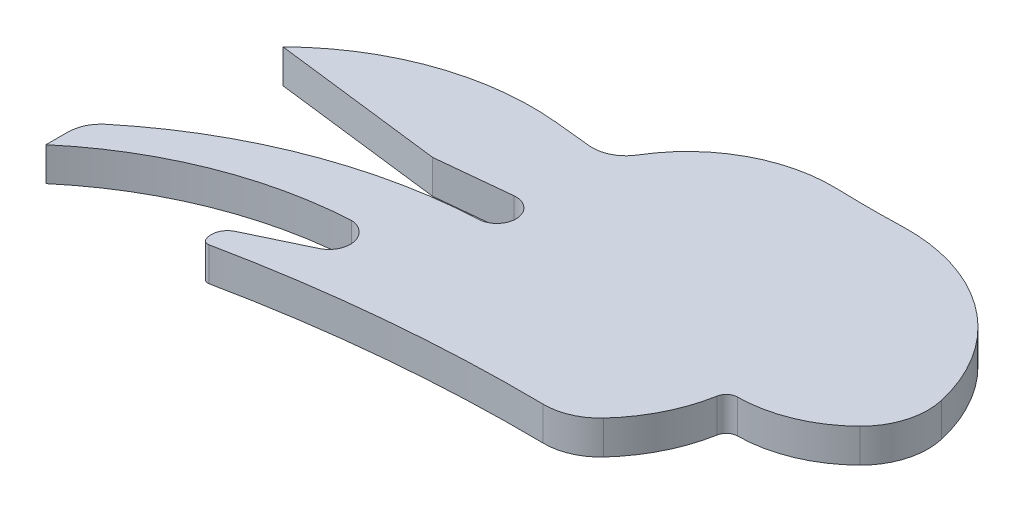
ISO-10303-21;
HEADER;
FILE_DESCRIPTION(('STEP AP214'),'2;1');
FILE_NAME('part.step','',(''),(''),'','','');
FILE_SCHEMA(('AUTOMOTIVE_DESIGN { 1 0 10303 214 1 1 1 1 }'));
ENDSEC;
DATA;
#1=APPLICATION_CONTEXT('core data for automotive mechanical design processes');
#2=APPLICATION_PROTOCOL_DEFINITION('international standard','automotive_design',2000,#1);
#3=PRODUCT_CONTEXT('',#1,'mechanical');
#4=PRODUCT('Part','Part','',(#3));
#5=PRODUCT_RELATED_PRODUCT_CATEGORY('part','',(#4));
#6=PRODUCT_DEFINITION_FORMATION('','',#4);
#7=PRODUCT_DEFINITION_CONTEXT('part definition',#1,'design');
#8=PRODUCT_DEFINITION('design','',#6,#7);
#9=PRODUCT_DEFINITION_SHAPE('','',#8);
#10=(LENGTH_UNIT() NAMED_UNIT(*) SI_UNIT(.MILLI.,.METRE.));
#11=(NAMED_UNIT(*) PLANE_ANGLE_UNIT() SI_UNIT($,.RADIAN.));
#12=(NAMED_UNIT(*) SI_UNIT($,.STERADIAN.) SOLID_ANGLE_UNIT());
#13=UNCERTAINTY_MEASURE_WITH_UNIT(LENGTH_MEASURE(1.E-05),#10,'distance_accuracy_value','');
#14=(GEOMETRIC_REPRESENTATION_CONTEXT(3) GLOBAL_UNCERTAINTY_ASSIGNED_CONTEXT((#13)) GLOBAL_UNIT_ASSIGNED_CONTEXT((#10,
#11,#12)) REPRESENTATION_CONTEXT('',''));
#15=CARTESIAN_POINT('',(0.,0.,0.));
#16=DIRECTION('',(0.,0.,1.));
#17=DIRECTION('',(1.,0.,0.));
#18=AXIS2_PLACEMENT_3D('',#15,#16,#17);
#19=CARTESIAN_POINT('',(0.,3.,-0.53));
#20=DIRECTION('',(-1.,0.,0.));
#21=DIRECTION('',(0.,0.,1.));
#22=AXIS2_PLACEMENT_3D('',#19,#20,#21);
#23=PLANE('',#22);
#24=DIRECTION('',(0.,0.,-1.));
#25=VECTOR('',#24,1.);
#26=CARTESIAN_POINT('',(0.,3.,-0.53));
#27=LINE('',#26,#25);
#28=CARTESIAN_POINT('',(0.,3.,-0.529999999999989));
#29=VERTEX_POINT('',#28);
#30=CARTESIAN_POINT('',(0.,3.,-2.45030055685));
#31=VERTEX_POINT('',#30);
#32=EDGE_CURVE('E198',#29,#31,#27,.T.);
#33=ORIENTED_EDGE('',*,*,#32,.T.);
#34=DIRECTION('',(0.,-1.,0.));
#35=VECTOR('',#34,1.);
#36=CARTESIAN_POINT('',(0.,3.,-2.45030055685));
#37=LINE('',#36,#35);
#38=CARTESIAN_POINT('',(0.,0.,-2.45030055685));
#39=VERTEX_POINT('',#38);
#40=EDGE_CURVE('E240',#31,#39,#37,.T.);
#41=ORIENTED_EDGE('',*,*,#40,.T.);
#42=DIRECTION('',(0.,0.,-1.));
#43=VECTOR('',#42,1.);
#44=CARTESIAN_POINT('',(0.,0.,-0.53));
#45=LINE('',#44,#43);
#46=CARTESIAN_POINT('',(0.,0.,-0.529999999999989));
#47=VERTEX_POINT('',#46);
#48=EDGE_CURVE('E381',#47,#39,#45,.T.);
#49=ORIENTED_EDGE('',*,*,#48,.F.);
#50=DIRECTION('',(0.,-1.,0.));
#51=VECTOR('',#50,1.);
#52=CARTESIAN_POINT('',(0.,3.,-0.529999999999989));
#53=LINE('',#52,#51);
#54=EDGE_CURVE('E224',#29,#47,#53,.T.);
#55=ORIENTED_EDGE('',*,*,#54,.F.);
#56=EDGE_LOOP('',(#33,#41,#49,#55));
#57=FACE_BOUND('',#56,.T.);
#58=ADVANCED_FACE('F33',(#57),#23,.T.);
#59=CARTESIAN_POINT('',(21.2415581415774,3.,24.490852788314));
#60=DIRECTION('',(0.,-1.,0.));
#61=DIRECTION('',(0.,0.,-1.));
#62=AXIS2_PLACEMENT_3D('',#59,#60,#61);
#63=CYLINDRICAL_SURFACE('',#62,32.8214391295765);
#64=CARTESIAN_POINT('',(21.2415581415774,0.,24.490852788314));
#65=DIRECTION('',(0.,-1.,0.));
#66=DIRECTION('',(0.,0.,-1.));
#67=AXIS2_PLACEMENT_3D('',#64,#65,#66);
#68=CIRCLE('',#67,32.8214391295765);
#69=CARTESIAN_POINT('',(19.42,0.,-8.28));
#70=VERTEX_POINT('',#69);
#71=EDGE_CURVE('E306',#47,#70,#68,.T.);
#72=ORIENTED_EDGE('',*,*,#71,.T.);
#73=DIRECTION('',(0.,-1.,0.));
#74=VECTOR('',#73,1.);
#75=CARTESIAN_POINT('',(19.42,3.,-8.28));
#76=LINE('',#75,#74);
#77=CARTESIAN_POINT('',(19.42,3.,-8.28));
#78=VERTEX_POINT('',#77);
#79=EDGE_CURVE('E309',#78,#70,#76,.T.);
#80=ORIENTED_EDGE('',*,*,#79,.F.);
#81=CARTESIAN_POINT('',(21.2415581415774,3.,24.490852788314));
#82=DIRECTION('',(0.,-1.,0.));
#83=DIRECTION('',(0.,0.,-1.));
#84=AXIS2_PLACEMENT_3D('',#81,#82,#83);
#85=CIRCLE('',#84,32.8214391295765);
#86=EDGE_CURVE('E212',#29,#78,#85,.T.);
#87=ORIENTED_EDGE('',*,*,#86,.F.);
#88=ORIENTED_EDGE('',*,*,#54,.T.);
#89=EDGE_LOOP('',(#72,#80,#87,#88));
#90=FACE_BOUND('',#89,.T.);
#91=ADVANCED_FACE('F428',(#90),#63,.F.);
#92=CARTESIAN_POINT('',(19.3041987318064,3.,-6.3835322132225));
#93=DIRECTION('',(0.,-1.,0.));
#94=DIRECTION('',(0.,0.,-1.));
#95=AXIS2_PLACEMENT_3D('',#92,#93,#94);
#96=CYLINDRICAL_SURFACE('',#95,1.9);
#97=CARTESIAN_POINT('',(19.3041987318064,0.,-6.3835322132225));
#98=DIRECTION('',(0.,-1.,0.));
#99=DIRECTION('',(0.,0.,-1.));
#100=AXIS2_PLACEMENT_3D('',#97,#98,#99);
#101=CIRCLE('',#100,1.9);
#102=CARTESIAN_POINT('',(20.1225437860053,0.,-4.66879859768098));
#103=VERTEX_POINT('',#102);
#104=EDGE_CURVE('E304',#70,#103,#101,.T.);
#105=ORIENTED_EDGE('',*,*,#104,.T.);
#106=DIRECTION('',(0.,-1.,0.));
#107=VECTOR('',#106,1.);
#108=CARTESIAN_POINT('',(20.1225437860053,3.,-4.66879859768098));
#109=LINE('',#108,#107);
#110=CARTESIAN_POINT('',(20.1225437860053,3.,-4.66879859768098));
#111=VERTEX_POINT('',#110);
#112=EDGE_CURVE('E312',#111,#103,#109,.T.);
#113=ORIENTED_EDGE('',*,*,#112,.F.);
#114=CARTESIAN_POINT('',(19.3041987318064,3.,-6.3835322132225));
#115=DIRECTION('',(0.,-1.,0.));
#116=DIRECTION('',(0.,0.,-1.));
#117=AXIS2_PLACEMENT_3D('',#114,#115,#116);
#118=CIRCLE('',#117,1.9);
#119=EDGE_CURVE('E216',#78,#111,#118,.T.);
#120=ORIENTED_EDGE('',*,*,#119,.F.);
#121=ORIENTED_EDGE('',*,*,#79,.T.);
#122=EDGE_LOOP('',(#105,#113,#120,#121));
#123=FACE_BOUND('',#122,.T.);
#124=ADVANCED_FACE('F433',(#123),#96,.F.);
#125=CARTESIAN_POINT('',(20.1225437860053,3.,-4.66879859768098));
#126=DIRECTION('',(0.430707923262615,0.,0.902491376600799));
#127=DIRECTION('',(0.902491376600799,0.,-0.430707923262615));
#128=AXIS2_PLACEMENT_3D('',#125,#126,#127);
#129=PLANE('',#128);
#130=DIRECTION('',(-0.902491376600799,0.,0.430707923262615));
#131=VECTOR('',#130,1.);
#132=CARTESIAN_POINT('',(20.1225437860053,0.,-4.66879859768098));
#133=LINE('',#132,#131);
#134=CARTESIAN_POINT('',(15.0924937069669,0.,-2.26824111910476));
#135=VERTEX_POINT('',#134);
#136=EDGE_CURVE('E296',#103,#135,#133,.T.);
#137=ORIENTED_EDGE('',*,*,#136,.T.);
#138=DIRECTION('',(0.,-1.,0.));
#139=VECTOR('',#138,1.);
#140=CARTESIAN_POINT('',(15.0924937069669,3.,-2.26824111910476));
#141=LINE('',#140,#139);
#142=CARTESIAN_POINT('',(15.0924937069669,3.,-2.26824111910476));
#143=VERTEX_POINT('',#142);
#144=EDGE_CURVE('E315',#143,#135,#141,.T.);
#145=ORIENTED_EDGE('',*,*,#144,.F.);
#146=DIRECTION('',(-0.902491376600799,0.,0.430707923262615));
#147=VECTOR('',#146,1.);
#148=CARTESIAN_POINT('',(20.1225437860053,3.,-4.66879859768098));
#149=LINE('',#148,#147);
#150=EDGE_CURVE('E377',#111,#143,#149,.T.);
#151=ORIENTED_EDGE('',*,*,#150,.F.);
#152=ORIENTED_EDGE('',*,*,#112,.T.);
#153=EDGE_LOOP('',(#137,#145,#151,#152));
#154=FACE_BOUND('',#153,.T.);
#155=ADVANCED_FACE('F497',(#154),#129,.F.);
#156=CARTESIAN_POINT('',(15.7170201956977,3.,-0.959628623033598));
#157=DIRECTION('',(0.,-1.,0.));
#158=DIRECTION('',(0.,0.,-1.));
#159=AXIS2_PLACEMENT_3D('',#156,#157,#158);
#160=CYLINDRICAL_SURFACE('',#159,1.45);
#161=CARTESIAN_POINT('',(15.7170201956977,0.,-0.959628623033598));
#162=DIRECTION('',(0.,-1.,0.));
#163=DIRECTION('',(0.,0.,-1.));
#164=AXIS2_PLACEMENT_3D('',#161,#162,#163);
#165=CIRCLE('',#164,1.45);
#166=CARTESIAN_POINT('',(14.4031751109504,0.,-0.346186618207208));
#167=VERTEX_POINT('',#166);
#168=EDGE_CURVE('E293',#167,#135,#165,.T.);
#169=ORIENTED_EDGE('',*,*,#168,.F.);
#170=DIRECTION('',(0.,-1.,0.));
#171=VECTOR('',#170,1.);
#172=CARTESIAN_POINT('',(14.4031751109504,3.,-0.346186618207208));
#173=LINE('',#172,#171);
#174=CARTESIAN_POINT('',(14.4031751109504,3.,-0.346186618207208));
#175=VERTEX_POINT('',#174);
#176=EDGE_CURVE('E41',#167,#175,#173,.F.);
#177=ORIENTED_EDGE('',*,*,#176,.T.);
#178=CARTESIAN_POINT('',(15.7170201956977,3.,-0.959628623033598));
#179=DIRECTION('',(0.,-1.,0.));
#180=DIRECTION('',(0.,0.,-1.));
#181=AXIS2_PLACEMENT_3D('',#178,#179,#180);
#182=CIRCLE('',#181,1.45);
#183=EDGE_CURVE('E375',#175,#143,#182,.T.);
#184=ORIENTED_EDGE('',*,*,#183,.T.);
#185=ORIENTED_EDGE('',*,*,#144,.T.);
#186=EDGE_LOOP('',(#169,#177,#184,#185));
#187=FACE_BOUND('',#186,.T.);
#188=ADVANCED_FACE('F471',(#187),#160,.T.);
#189=CARTESIAN_POINT('',(40.3394246692763,3.,122.849662581525));
#190=DIRECTION('',(0.,-1.,0.));
#191=DIRECTION('',(0.,0.,-1.));
#192=AXIS2_PLACEMENT_3D('',#189,#190,#191);
#193=CYLINDRICAL_SURFACE('',#192,125.511011920149);
#194=CARTESIAN_POINT('',(40.3394246692763,3.,122.849662581525));
#195=DIRECTION('',(0.,-1.,0.));
#196=DIRECTION('',(0.,0.,-1.));
#197=AXIS2_PLACEMENT_3D('',#194,#195,#196);
#198=CIRCLE('',#197,125.511011920149);
#199=CARTESIAN_POINT('',(14.9573401107634,3.,-0.0680493101476443));
#200=VERTEX_POINT('',#199);
#201=CARTESIAN_POINT('',(42.0864421166134,3.,-2.6491901752171));
#202=VERTEX_POINT('',#201);
#203=EDGE_CURVE('E287',#200,#202,#198,.T.);
#204=ORIENTED_EDGE('',*,*,#203,.F.);
#205=DIRECTION('',(0.,-1.,0.));
#206=VECTOR('',#205,1.);
#207=CARTESIAN_POINT('',(14.9573401107634,3.,-0.0680493101476443));
#208=LINE('',#207,#206);
#209=CARTESIAN_POINT('',(14.9573401107634,0.,-0.0680493101476443));
#210=VERTEX_POINT('',#209);
#211=EDGE_CURVE('E279',#200,#210,#208,.T.);
#212=ORIENTED_EDGE('',*,*,#211,.T.);
#213=CARTESIAN_POINT('',(40.3394246692763,0.,122.849662581525));
#214=DIRECTION('',(0.,-1.,0.));
#215=DIRECTION('',(0.,0.,-1.));
#216=AXIS2_PLACEMENT_3D('',#213,#214,#215);
#217=CIRCLE('',#216,125.511011920149);
#218=CARTESIAN_POINT('',(42.0864421166134,0.,-2.6491901752171));
#219=VERTEX_POINT('',#218);
#220=EDGE_CURVE('E286',#210,#219,#217,.T.);
#221=ORIENTED_EDGE('',*,*,#220,.T.);
#222=DIRECTION('',(0.,-1.,0.));
#223=VECTOR('',#222,1.);
#224=CARTESIAN_POINT('',(42.0864421166134,3.,-2.64919017521713));
#225=LINE('',#224,#223);
#226=EDGE_CURVE('E274',#219,#202,#225,.F.);
#227=ORIENTED_EDGE('',*,*,#226,.T.);
#228=EDGE_LOOP('',(#204,#212,#221,#227));
#229=FACE_BOUND('',#228,.T.);
#230=ADVANCED_FACE('F285',(#229),#193,.F.);
#231=CARTESIAN_POINT('',(35.9267681905486,3.,-13.4056740718196));
#232=DIRECTION('',(0.,-1.,0.));
#233=DIRECTION('',(0.,0.,-1.));
#234=AXIS2_PLACEMENT_3D('',#231,#232,#233);
#235=CYLINDRICAL_SURFACE('',#234,13.4821276747402);
#236=CARTESIAN_POINT('',(35.9267681905486,3.,-13.4056740718196));
#237=DIRECTION('',(0.,1.,0.));
#238=DIRECTION('',(0.,0.,1.));
#239=AXIS2_PLACEMENT_3D('',#236,#237,#238);
#240=CIRCLE('',#239,13.4821276747402);
#241=CARTESIAN_POINT('',(45.8280356718605,3.,-4.25511841101342));
#242=VERTEX_POINT('',#241);
#243=CARTESIAN_POINT('',(49.1949671002402,3.,-11.0134649816991));
#244=VERTEX_POINT('',#243);
#245=EDGE_CURVE('E367',#242,#244,#240,.T.);
#246=ORIENTED_EDGE('',*,*,#245,.F.);
#247=DIRECTION('',(0.,-1.,0.));
#248=VECTOR('',#247,1.);
#249=CARTESIAN_POINT('',(45.8280356718605,3.,-4.25511841101342));
#250=LINE('',#249,#248);
#251=CARTESIAN_POINT('',(45.8280356718605,0.,-4.25511841101342));
#252=VERTEX_POINT('',#251);
#253=EDGE_CURVE('E268',#242,#252,#250,.T.);
#254=ORIENTED_EDGE('',*,*,#253,.T.);
#255=CARTESIAN_POINT('',(35.9267681905486,0.,-13.4056740718196));
#256=DIRECTION('',(0.,1.,0.));
#257=DIRECTION('',(0.,0.,1.));
#258=AXIS2_PLACEMENT_3D('',#255,#256,#257);
#259=CIRCLE('',#258,13.4821276747402);
#260=CARTESIAN_POINT('',(49.1949671002402,0.,-11.0134649816991));
#261=VERTEX_POINT('',#260);
#262=EDGE_CURVE('E294',#252,#261,#259,.T.);
#263=ORIENTED_EDGE('',*,*,#262,.T.);
#264=DIRECTION('',(0.,-1.,0.));
#265=VECTOR('',#264,1.);
#266=CARTESIAN_POINT('',(49.1949671002402,3.,-11.0134649816991));
#267=LINE('',#266,#265);
#268=EDGE_CURVE('E260',#261,#244,#267,.F.);
#269=ORIENTED_EDGE('',*,*,#268,.T.);
#270=EDGE_LOOP('',(#246,#254,#263,#269));
#271=FACE_BOUND('',#270,.T.);
#272=ADVANCED_FACE('F462',(#271),#235,.T.);
#273=CARTESIAN_POINT('',(50.0588092689043,3.,-22.9566915039352));
#274=DIRECTION('',(0.,-1.,0.));
#275=DIRECTION('',(0.,0.,-1.));
#276=AXIS2_PLACEMENT_3D('',#273,#274,#275);
#277=CYLINDRICAL_SURFACE('',#276,11.1212589876023);
#278=CARTESIAN_POINT('',(50.0588092689043,3.,-22.9566915039352));
#279=DIRECTION('',(0.,-1.,0.));
#280=DIRECTION('',(0.,0.,-1.));
#281=AXIS2_PLACEMENT_3D('',#278,#279,#280);
#282=CIRCLE('',#281,11.1212589876023);
#283=CARTESIAN_POINT('',(57.8595585532233,3.,-15.0301088813593));
#284=VERTEX_POINT('',#283);
#285=CARTESIAN_POINT('',(50.1691756111334,3.,-11.8359801624863));
#286=VERTEX_POINT('',#285);
#287=EDGE_CURVE('E365',#284,#286,#282,.T.);
#288=ORIENTED_EDGE('',*,*,#287,.T.);
#289=DIRECTION('',(0.,-1.,0.));
#290=VECTOR('',#289,1.);
#291=CARTESIAN_POINT('',(50.1691756111334,3.,-11.8359801624863));
#292=LINE('',#291,#290);
#293=CARTESIAN_POINT('',(50.1691756111334,0.,-11.8359801624863));
#294=VERTEX_POINT('',#293);
#295=EDGE_CURVE('E257',#286,#294,#292,.T.);
#296=ORIENTED_EDGE('',*,*,#295,.T.);
#297=CARTESIAN_POINT('',(50.0588092689043,0.,-22.9566915039352));
#298=DIRECTION('',(0.,-1.,0.));
#299=DIRECTION('',(0.,0.,-1.));
#300=AXIS2_PLACEMENT_3D('',#297,#298,#299);
#301=CIRCLE('',#300,11.1212589876023);
#302=CARTESIAN_POINT('',(57.8595585532233,0.,-15.0301088813593));
#303=VERTEX_POINT('',#302);
#304=EDGE_CURVE('E298',#303,#294,#301,.T.);
#305=ORIENTED_EDGE('',*,*,#304,.F.);
#306=DIRECTION('',(0.,-1.,0.));
#307=VECTOR('',#306,1.);
#308=CARTESIAN_POINT('',(57.8595585532233,3.,-15.0301088813593));
#309=LINE('',#308,#307);
#310=EDGE_CURVE('E226',#303,#284,#309,.F.);
#311=ORIENTED_EDGE('',*,*,#310,.T.);
#312=EDGE_LOOP('',(#288,#296,#305,#311));
#313=FACE_BOUND('',#312,.T.);
#314=ADVANCED_FACE('F355',(#313),#277,.T.);
#315=CARTESIAN_POINT('',(44.8756529626829,3.,-17.3082270959628));
#316=DIRECTION('',(0.,-1.,0.));
#317=DIRECTION('',(0.,0.,-1.));
#318=AXIS2_PLACEMENT_3D('',#315,#316,#317);
#319=CYLINDRICAL_SURFACE('',#318,15.);
#320=CARTESIAN_POINT('',(44.8756529626829,0.,-17.3082270959628));
#321=DIRECTION('',(0.,-1.,0.));
#322=DIRECTION('',(0.,0.,-1.));
#323=AXIS2_PLACEMENT_3D('',#320,#321,#322);
#324=CIRCLE('',#323,15.);
#325=CARTESIAN_POINT('',(44.3947945783583,0.,-32.300517621904));
#326=VERTEX_POINT('',#325);
#327=CARTESIAN_POINT('',(59.5012274511255,0.,-20.6387782339905));
#328=VERTEX_POINT('',#327);
#329=EDGE_CURVE('E347',#326,#328,#324,.T.);
#330=ORIENTED_EDGE('',*,*,#329,.F.);
#331=DIRECTION('',(0.,-1.,0.));
#332=VECTOR('',#331,1.);
#333=CARTESIAN_POINT('',(44.3947945783583,3.,-32.300517621904));
#334=LINE('',#333,#332);
#335=CARTESIAN_POINT('',(44.3947945783583,3.,-32.300517621904));
#336=VERTEX_POINT('',#335);
#337=EDGE_CURVE('E234',#326,#336,#334,.F.);
#338=ORIENTED_EDGE('',*,*,#337,.T.);
#339=CARTESIAN_POINT('',(44.8756529626829,3.,-17.3082270959628));
#340=DIRECTION('',(0.,-1.,0.));
#341=DIRECTION('',(0.,0.,-1.));
#342=AXIS2_PLACEMENT_3D('',#339,#340,#341);
#343=CIRCLE('',#342,15.);
#344=CARTESIAN_POINT('',(59.5012274511255,3.,-20.6387782339905));
#345=VERTEX_POINT('',#344);
#346=EDGE_CURVE('E363',#336,#345,#343,.T.);
#347=ORIENTED_EDGE('',*,*,#346,.T.);
#348=DIRECTION('',(0.,-1.,0.));
#349=VECTOR('',#348,1.);
#350=CARTESIAN_POINT('',(59.5012274511255,3.,-20.6387782339905));
#351=LINE('',#350,#349);
#352=EDGE_CURVE('E220',#345,#328,#351,.T.);
#353=ORIENTED_EDGE('',*,*,#352,.T.);
#354=EDGE_LOOP('',(#330,#338,#347,#353));
#355=FACE_BOUND('',#354,.T.);
#356=ADVANCED_FACE('F469',(#355),#319,.T.);
#357=CARTESIAN_POINT('',(38.1770409043876,3.,-19.3814581501427));
#358=DIRECTION('',(0.,-1.,0.));
#359=DIRECTION('',(0.,0.,-1.));
#360=AXIS2_PLACEMENT_3D('',#357,#358,#359);
#361=CYLINDRICAL_SURFACE('',#360,12.9267689458201);
#362=CARTESIAN_POINT('',(38.1770409043876,0.,-19.3814581501427));
#363=DIRECTION('',(0.,1.,0.));
#364=DIRECTION('',(0.,0.,1.));
#365=AXIS2_PLACEMENT_3D('',#362,#363,#364);
#366=CIRCLE('',#365,12.9267689458201);
#367=CARTESIAN_POINT('',(38.5955889086408,0.,-32.3014493632494));
#368=VERTEX_POINT('',#367);
#369=CARTESIAN_POINT('',(27.0957801723834,0.,-26.037809700952));
#370=VERTEX_POINT('',#369);
#371=EDGE_CURVE('E344',#368,#370,#366,.T.);
#372=ORIENTED_EDGE('',*,*,#371,.T.);
#373=DIRECTION('',(0.,-1.,0.));
#374=VECTOR('',#373,1.);
#375=CARTESIAN_POINT('',(27.0957801723834,3.,-26.037809700952));
#376=LINE('',#375,#374);
#377=CARTESIAN_POINT('',(27.0957801723834,3.,-26.037809700952));
#378=VERTEX_POINT('',#377);
#379=EDGE_CURVE('E251',#370,#378,#376,.F.);
#380=ORIENTED_EDGE('',*,*,#379,.T.);
#381=CARTESIAN_POINT('',(38.1770409043876,3.,-19.3814581501427));
#382=DIRECTION('',(0.,1.,0.));
#383=DIRECTION('',(0.,0.,1.));
#384=AXIS2_PLACEMENT_3D('',#381,#382,#383);
#385=CIRCLE('',#384,12.9267689458201);
#386=CARTESIAN_POINT('',(38.5955889086408,3.,-32.3014493632494));
#387=VERTEX_POINT('',#386);
#388=EDGE_CURVE('E370',#387,#378,#385,.T.);
#389=ORIENTED_EDGE('',*,*,#388,.F.);
#390=DIRECTION('',(0.,-1.,0.));
#391=VECTOR('',#390,1.);
#392=CARTESIAN_POINT('',(38.5955889086408,3.,-32.3014493632494));
#393=LINE('',#392,#391);
#394=EDGE_CURVE('E231',#387,#368,#393,.T.);
#395=ORIENTED_EDGE('',*,*,#394,.T.);
#396=EDGE_LOOP('',(#372,#380,#389,#395));
#397=FACE_BOUND('',#396,.T.);
#398=ADVANCED_FACE('F477',(#397),#361,.T.);
#399=CARTESIAN_POINT('',(26.26,3.,-24.39));
#400=DIRECTION('',(-0.101455796018974,0.,0.994840048175663));
#401=DIRECTION('',(0.994840048175664,0.,0.101455796018974));
#402=AXIS2_PLACEMENT_3D('',#399,#400,#401);
#403=PLANE('',#402);
#404=DIRECTION('',(-0.994840048175663,0.,-0.101455796018974));
#405=VECTOR('',#404,1.);
#406=CARTESIAN_POINT('',(26.26,3.,-24.39));
#407=LINE('',#406,#405);
#408=CARTESIAN_POINT('',(24.2197119722096,3.,-24.5980726910291));
#409=VERTEX_POINT('',#408);
#410=CARTESIAN_POINT('',(21.0032363372205,3.,-24.9260953681639));
#411=VERTEX_POINT('',#410);
#412=EDGE_CURVE('E398',#409,#411,#407,.T.);
#413=ORIENTED_EDGE('',*,*,#412,.F.);
#414=DIRECTION('',(0.,1.,0.));
#415=VECTOR('',#414,1.);
#416=CARTESIAN_POINT('',(24.2197119722096,0.,-24.5980726910291));
#417=LINE('',#416,#415);
#418=CARTESIAN_POINT('',(24.2197119722096,0.,-24.5980726910291));
#419=VERTEX_POINT('',#418);
#420=EDGE_CURVE('E248',#409,#419,#417,.F.);
#421=ORIENTED_EDGE('',*,*,#420,.T.);
#422=DIRECTION('',(-0.994840048175663,0.,-0.101455796018974));
#423=VECTOR('',#422,1.);
#424=CARTESIAN_POINT('',(26.26,0.,-24.39));
#425=LINE('',#424,#423);
#426=CARTESIAN_POINT('',(21.0032363372205,0.,-24.9260953681639));
#427=VERTEX_POINT('',#426);
#428=EDGE_CURVE('E342',#419,#427,#425,.T.);
#429=ORIENTED_EDGE('',*,*,#428,.T.);
#430=DIRECTION('',(0.,-1.,0.));
#431=VECTOR('',#430,1.);
#432=CARTESIAN_POINT('',(21.0032363372205,3.,-24.9260953681639));
#433=LINE('',#432,#431);
#434=EDGE_CURVE('E318',#411,#427,#433,.T.);
#435=ORIENTED_EDGE('',*,*,#434,.F.);
#436=EDGE_LOOP('',(#413,#421,#429,#435));
#437=FACE_BOUND('',#436,.T.);
#438=ADVANCED_FACE('F411',(#437),#403,.F.);
#439=CARTESIAN_POINT('',(18.7283734708491,3.,-2.61958581053662));
#440=DIRECTION('',(0.,-1.,0.));
#441=DIRECTION('',(0.,0.,-1.));
#442=AXIS2_PLACEMENT_3D('',#439,#440,#441);
#443=CYLINDRICAL_SURFACE('',#442,22.4222070658825);
#444=CARTESIAN_POINT('',(18.7283734708491,0.,-2.61958581053662));
#445=DIRECTION('',(0.,1.,0.));
#446=DIRECTION('',(0.,0.,1.));
#447=AXIS2_PLACEMENT_3D('',#444,#445,#446);
#448=CIRCLE('',#447,22.4222070658825);
#449=CARTESIAN_POINT('',(3.,0.,-18.6));
#450=VERTEX_POINT('',#449);
#451=EDGE_CURVE('E335',#427,#450,#448,.T.);
#452=ORIENTED_EDGE('',*,*,#451,.T.);
#453=DIRECTION('',(0.,-1.,0.));
#454=VECTOR('',#453,1.);
#455=CARTESIAN_POINT('',(3.,3.,-18.6));
#456=LINE('',#455,#454);
#457=CARTESIAN_POINT('',(3.,3.,-18.6));
#458=VERTEX_POINT('',#457);
#459=EDGE_CURVE('E321',#458,#450,#456,.T.);
#460=ORIENTED_EDGE('',*,*,#459,.F.);
#461=CARTESIAN_POINT('',(18.7283734708491,3.,-2.61958581053662));
#462=DIRECTION('',(0.,1.,0.));
#463=DIRECTION('',(0.,0.,1.));
#464=AXIS2_PLACEMENT_3D('',#461,#462,#463);
#465=CIRCLE('',#464,22.4222070658825);
#466=EDGE_CURVE('E396',#411,#458,#465,.T.);
#467=ORIENTED_EDGE('',*,*,#466,.F.);
#468=ORIENTED_EDGE('',*,*,#434,.T.);
#469=EDGE_LOOP('',(#452,#460,#467,#468));
#470=FACE_BOUND('',#469,.T.);
#471=ADVANCED_FACE('F416',(#470),#443,.T.);
#472=CARTESIAN_POINT('',(3.,3.,-18.6));
#473=DIRECTION('',(0.121699057628055,0.,-0.992567045278274));
#474=DIRECTION('',(-0.992567045278274,0.,-0.121699057628055));
#475=AXIS2_PLACEMENT_3D('',#472,#473,#474);
#476=PLANE('',#475);
#477=DIRECTION('',(0.992567045278274,0.,0.121699057628055));
#478=VECTOR('',#477,1.);
#479=CARTESIAN_POINT('',(3.,0.,-18.6));
#480=LINE('',#479,#478);
#481=CARTESIAN_POINT('',(18.17,0.,-16.74));
#482=VERTEX_POINT('',#481);
#483=EDGE_CURVE('E333',#450,#482,#480,.T.);
#484=ORIENTED_EDGE('',*,*,#483,.T.);
#485=DIRECTION('',(0.,-1.,0.));
#486=VECTOR('',#485,1.);
#487=CARTESIAN_POINT('',(18.17,3.,-16.74));
#488=LINE('',#487,#486);
#489=CARTESIAN_POINT('',(18.17,3.,-16.74));
#490=VERTEX_POINT('',#489);
#491=EDGE_CURVE('E214',#490,#482,#488,.T.);
#492=ORIENTED_EDGE('',*,*,#491,.F.);
#493=DIRECTION('',(0.992567045278274,0.,0.121699057628055));
#494=VECTOR('',#493,1.);
#495=CARTESIAN_POINT('',(3.,3.,-18.6));
#496=LINE('',#495,#494);
#497=EDGE_CURVE('E394',#458,#490,#496,.T.);
#498=ORIENTED_EDGE('',*,*,#497,.F.);
#499=ORIENTED_EDGE('',*,*,#459,.T.);
#500=EDGE_LOOP('',(#484,#492,#498,#499));
#501=FACE_BOUND('',#500,.T.);
#502=ADVANCED_FACE('F418',(#501),#476,.F.);
#503=CARTESIAN_POINT('',(18.17,3.,-16.74));
#504=DIRECTION('',(-0.10017523681856,0.,-0.994969809556222));
#505=DIRECTION('',(-0.994969809556222,0.,0.10017523681856));
#506=AXIS2_PLACEMENT_3D('',#503,#504,#505);
#507=PLANE('',#506);
#508=DIRECTION('',(0.994969809556222,0.,-0.10017523681856));
#509=VECTOR('',#508,1.);
#510=CARTESIAN_POINT('',(18.17,0.,-16.74));
#511=LINE('',#510,#509);
#512=CARTESIAN_POINT('',(24.7397020974084,0.,-17.4014486762456));
#513=VERTEX_POINT('',#512);
#514=EDGE_CURVE('E328',#482,#513,#511,.T.);
#515=ORIENTED_EDGE('',*,*,#514,.T.);
#516=DIRECTION('',(0.,-1.,0.));
#517=VECTOR('',#516,1.);
#518=CARTESIAN_POINT('',(24.7397020974084,3.,-17.4014486762456));
#519=LINE('',#518,#517);
#520=CARTESIAN_POINT('',(24.7397020974084,3.,-17.4014486762456));
#521=VERTEX_POINT('',#520);
#522=EDGE_CURVE('E211',#521,#513,#519,.T.);
#523=ORIENTED_EDGE('',*,*,#522,.F.);
#524=DIRECTION('',(0.994969809556222,0.,-0.10017523681856));
#525=VECTOR('',#524,1.);
#526=CARTESIAN_POINT('',(18.17,3.,-16.74));
#527=LINE('',#526,#525);
#528=EDGE_CURVE('E203',#490,#521,#527,.T.);
#529=ORIENTED_EDGE('',*,*,#528,.F.);
#530=ORIENTED_EDGE('',*,*,#491,.T.);
#531=EDGE_LOOP('',(#515,#523,#529,#530));
#532=FACE_BOUND('',#531,.T.);
#533=ADVANCED_FACE('F327',(#532),#507,.F.);
#534=CARTESIAN_POINT('',(24.91,3.,-15.71));
#535=DIRECTION('',(0.,-1.,0.));
#536=DIRECTION('',(0.,0.,-1.));
#537=AXIS2_PLACEMENT_3D('',#534,#535,#536);
#538=CYLINDRICAL_SURFACE('',#537,1.7);
#539=CARTESIAN_POINT('',(24.91,0.,-15.71));
#540=DIRECTION('',(0.,-1.,0.));
#541=DIRECTION('',(0.,0.,-1.));
#542=AXIS2_PLACEMENT_3D('',#539,#540,#541);
#543=CIRCLE('',#542,1.7);
#544=CARTESIAN_POINT('',(24.9911539078396,0.,-14.0119381509373));
#545=VERTEX_POINT('',#544);
#546=EDGE_CURVE('E210',#513,#545,#543,.T.);
#547=ORIENTED_EDGE('',*,*,#546,.T.);
#548=DIRECTION('',(0.,-1.,0.));
#549=VECTOR('',#548,1.);
#550=CARTESIAN_POINT('',(24.9911539078396,3.,-14.0119381509373));
#551=LINE('',#550,#549);
#552=CARTESIAN_POINT('',(24.9911539078396,3.,-14.0119381509373));
#553=VERTEX_POINT('',#552);
#554=EDGE_CURVE('E191',#553,#545,#551,.T.);
#555=ORIENTED_EDGE('',*,*,#554,.F.);
#556=CARTESIAN_POINT('',(24.91,3.,-15.71));
#557=DIRECTION('',(0.,-1.,0.));
#558=DIRECTION('',(0.,0.,-1.));
#559=AXIS2_PLACEMENT_3D('',#556,#557,#558);
#560=CIRCLE('',#559,1.7);
#561=EDGE_CURVE('E197',#521,#553,#560,.T.);
#562=ORIENTED_EDGE('',*,*,#561,.F.);
#563=ORIENTED_EDGE('',*,*,#522,.T.);
#564=EDGE_LOOP('',(#547,#555,#562,#563));
#565=FACE_BOUND('',#564,.T.);
#566=ADVANCED_FACE('F208',(#565),#538,.F.);
#567=CARTESIAN_POINT('',(26.9273642553726,3.,26.5012670714493));
#568=DIRECTION('',(0.,-1.,0.));
#569=DIRECTION('',(0.,0.,-1.));
#570=AXIS2_PLACEMENT_3D('',#567,#568,#569);
#571=CYLINDRICAL_SURFACE('',#570,40.5594465926387);
#572=CARTESIAN_POINT('',(26.9273642553726,0.,26.5012670714493));
#573=DIRECTION('',(0.,-1.,0.));
#574=DIRECTION('',(0.,0.,-1.));
#575=AXIS2_PLACEMENT_3D('',#572,#573,#574);
#576=CIRCLE('',#575,40.5594465926387);
#577=CARTESIAN_POINT('',(1.08884051076017,0.,-4.7627601579433));
#578=VERTEX_POINT('',#577);
#579=EDGE_CURVE('E337',#578,#545,#576,.T.);
#580=ORIENTED_EDGE('',*,*,#579,.F.);
#581=DIRECTION('',(0.,-1.,0.));
#582=VECTOR('',#581,1.);
#583=CARTESIAN_POINT('',(1.08884051076017,3.,-4.7627601579433));
#584=LINE('',#583,#582);
#585=CARTESIAN_POINT('',(1.08884051076017,3.,-4.7627601579433));
#586=VERTEX_POINT('',#585);
#587=EDGE_CURVE('E194',#578,#586,#584,.F.);
#588=ORIENTED_EDGE('',*,*,#587,.T.);
#589=CARTESIAN_POINT('',(26.9273642553726,3.,26.5012670714493));
#590=DIRECTION('',(0.,-1.,0.));
#591=DIRECTION('',(0.,0.,-1.));
#592=AXIS2_PLACEMENT_3D('',#589,#590,#591);
#593=CIRCLE('',#592,40.5594465926387);
#594=EDGE_CURVE('E186',#586,#553,#593,.T.);
#595=ORIENTED_EDGE('',*,*,#594,.T.);
#596=ORIENTED_EDGE('',*,*,#554,.T.);
#597=EDGE_LOOP('',(#580,#588,#595,#596));
#598=FACE_BOUND('',#597,.T.);
#599=ADVANCED_FACE('F189',(#598),#571,.T.);
#600=CARTESIAN_POINT('',(26.9273642553726,3.,26.5012670714493));
#601=DIRECTION('',(0.,-1.,0.));
#602=DIRECTION('',(0.,0.,-1.));
#603=AXIS2_PLACEMENT_3D('',#600,#601,#602);
#604=PLANE('',#603);
#605=ORIENTED_EDGE('',*,*,#183,.F.);
#606=CARTESIAN_POINT('',(14.8562251401716,3.,-0.557718344008482));
#607=DIRECTION('',(0.,-1.,0.));
#608=DIRECTION('',(0.,0.,-1.));
#609=AXIS2_PLACEMENT_3D('',#606,#607,#608);
#610=CIRCLE('',#609,0.5);
#611=EDGE_CURVE('E11',#175,#200,#610,.F.);
#612=ORIENTED_EDGE('',*,*,#611,.T.);
#613=ORIENTED_EDGE('',*,*,#203,.T.);
#614=CARTESIAN_POINT('',(42.1560382986778,3.,-7.64870578889832));
#615=DIRECTION('',(0.,-1.,0.));
#616=DIRECTION('',(0.,0.,-1.));
#617=AXIS2_PLACEMENT_3D('',#614,#615,#616);
#618=CIRCLE('',#617,5.);
#619=EDGE_CURVE('E277',#202,#242,#618,.F.);
#620=ORIENTED_EDGE('',*,*,#619,.T.);
#621=ORIENTED_EDGE('',*,*,#245,.T.);
#622=CARTESIAN_POINT('',(50.1790995183414,3.,-10.8360294056659));
#623=DIRECTION('',(0.,-1.,0.));
#624=DIRECTION('',(0.,0.,-1.));
#625=AXIS2_PLACEMENT_3D('',#622,#623,#624);
#626=CIRCLE('',#625,1.);
#627=EDGE_CURVE('E266',#244,#286,#626,.T.);
#628=ORIENTED_EDGE('',*,*,#627,.T.);
#629=ORIENTED_EDGE('',*,*,#287,.F.);
#630=CARTESIAN_POINT('',(53.6509976557484,3.,-19.3065577787794));
#631=DIRECTION('',(0.,-1.,0.));
#632=DIRECTION('',(0.,0.,-1.));
#633=AXIS2_PLACEMENT_3D('',#630,#631,#632);
#634=CIRCLE('',#633,6.);
#635=EDGE_CURVE('E228',#284,#345,#634,.F.);
#636=ORIENTED_EDGE('',*,*,#635,.T.);
#637=ORIENTED_EDGE('',*,*,#346,.F.);
#638=CARTESIAN_POINT('',(41.509644272411,3.,-122.254260777551));
#639=DIRECTION('',(0.,-1.,0.));
#640=DIRECTION('',(0.,0.,-1.));
#641=AXIS2_PLACEMENT_3D('',#638,#639,#640);
#642=CIRCLE('',#641,90.);
#643=EDGE_CURVE('E238',#336,#387,#642,.T.);
#644=ORIENTED_EDGE('',*,*,#643,.T.);
#645=ORIENTED_EDGE('',*,*,#388,.T.);
#646=CARTESIAN_POINT('',(24.5240793602665,3.,-27.5825928355561));
#647=DIRECTION('',(0.,-1.,0.));
#648=DIRECTION('',(0.,0.,-1.));
#649=AXIS2_PLACEMENT_3D('',#646,#647,#648);
#650=CIRCLE('',#649,3.);
#651=EDGE_CURVE('E255',#378,#409,#650,.T.);
#652=ORIENTED_EDGE('',*,*,#651,.T.);
#653=ORIENTED_EDGE('',*,*,#412,.T.);
#654=ORIENTED_EDGE('',*,*,#466,.T.);
#655=ORIENTED_EDGE('',*,*,#497,.T.);
#656=ORIENTED_EDGE('',*,*,#528,.T.);
#657=ORIENTED_EDGE('',*,*,#561,.T.);
#658=ORIENTED_EDGE('',*,*,#594,.F.);
#659=CARTESIAN_POINT('',(3.,3.,-2.45030055685));
#660=DIRECTION('',(0.,-1.,0.));
#661=DIRECTION('',(0.,0.,-1.));
#662=AXIS2_PLACEMENT_3D('',#659,#660,#661);
#663=CIRCLE('',#662,3.);
#664=EDGE_CURVE('E246',#586,#31,#663,.F.);
#665=ORIENTED_EDGE('',*,*,#664,.T.);
#666=ORIENTED_EDGE('',*,*,#32,.F.);
#667=ORIENTED_EDGE('',*,*,#86,.T.);
#668=ORIENTED_EDGE('',*,*,#119,.T.);
#669=ORIENTED_EDGE('',*,*,#150,.T.);
#670=EDGE_LOOP('',(#605,#612,#613,#620,#621,#628,#629,#636,#637,#644,#645,#652,#653,#654,#655,
#656,#657,#658,#665,#666,#667,#668,#669));
#671=FACE_BOUND('',#670,.T.);
#672=ADVANCED_FACE('F201',(#671),#604,.F.);
#673=CARTESIAN_POINT('',(26.9273642553726,0.,26.5012670714493));
#674=DIRECTION('',(0.,-1.,0.));
#675=DIRECTION('',(0.,0.,-1.));
#676=AXIS2_PLACEMENT_3D('',#673,#674,#675);
#677=PLANE('',#676);
#678=ORIENTED_EDGE('',*,*,#220,.F.);
#679=CARTESIAN_POINT('',(14.8562251401716,0.,-0.557718344008482));
#680=DIRECTION('',(0.,-1.,0.));
#681=DIRECTION('',(0.,0.,-1.));
#682=AXIS2_PLACEMENT_3D('',#679,#680,#681);
#683=CIRCLE('',#682,0.5);
#684=EDGE_CURVE('E55',#210,#167,#683,.T.);
#685=ORIENTED_EDGE('',*,*,#684,.T.);
#686=ORIENTED_EDGE('',*,*,#168,.T.);
#687=ORIENTED_EDGE('',*,*,#136,.F.);
#688=ORIENTED_EDGE('',*,*,#104,.F.);
#689=ORIENTED_EDGE('',*,*,#71,.F.);
#690=ORIENTED_EDGE('',*,*,#48,.T.);
#691=CARTESIAN_POINT('',(3.,0.,-2.45030055685));
#692=DIRECTION('',(0.,-1.,0.));
#693=DIRECTION('',(0.,0.,-1.));
#694=AXIS2_PLACEMENT_3D('',#691,#692,#693);
#695=CIRCLE('',#694,3.);
#696=EDGE_CURVE('E243',#39,#578,#695,.T.);
#697=ORIENTED_EDGE('',*,*,#696,.T.);
#698=ORIENTED_EDGE('',*,*,#579,.T.);
#699=ORIENTED_EDGE('',*,*,#546,.F.);
#700=ORIENTED_EDGE('',*,*,#514,.F.);
#701=ORIENTED_EDGE('',*,*,#483,.F.);
#702=ORIENTED_EDGE('',*,*,#451,.F.);
#703=ORIENTED_EDGE('',*,*,#428,.F.);
#704=CARTESIAN_POINT('',(24.5240793602665,0.,-27.5825928355561));
#705=DIRECTION('',(0.,-1.,0.));
#706=DIRECTION('',(0.,0.,-1.));
#707=AXIS2_PLACEMENT_3D('',#704,#705,#706);
#708=CIRCLE('',#707,3.);
#709=EDGE_CURVE('E253',#419,#370,#708,.F.);
#710=ORIENTED_EDGE('',*,*,#709,.T.);
#711=ORIENTED_EDGE('',*,*,#371,.F.);
#712=CARTESIAN_POINT('',(41.509644272411,0.,-122.254260777551));
#713=DIRECTION('',(0.,-1.,0.));
#714=DIRECTION('',(0.,0.,-1.));
#715=AXIS2_PLACEMENT_3D('',#712,#713,#714);
#716=CIRCLE('',#715,90.);
#717=EDGE_CURVE('E236',#368,#326,#716,.F.);
#718=ORIENTED_EDGE('',*,*,#717,.T.);
#719=ORIENTED_EDGE('',*,*,#329,.T.);
#720=CARTESIAN_POINT('',(53.6509976557484,0.,-19.3065577787794));
#721=DIRECTION('',(0.,-1.,0.));
#722=DIRECTION('',(0.,0.,-1.));
#723=AXIS2_PLACEMENT_3D('',#720,#721,#722);
#724=CIRCLE('',#723,6.);
#725=EDGE_CURVE('E223',#328,#303,#724,.T.);
#726=ORIENTED_EDGE('',*,*,#725,.T.);
#727=ORIENTED_EDGE('',*,*,#304,.T.);
#728=CARTESIAN_POINT('',(50.1790995183414,0.,-10.8360294056659));
#729=DIRECTION('',(0.,-1.,0.));
#730=DIRECTION('',(0.,0.,-1.));
#731=AXIS2_PLACEMENT_3D('',#728,#729,#730);
#732=CIRCLE('',#731,1.);
#733=EDGE_CURVE('E263',#294,#261,#732,.F.);
#734=ORIENTED_EDGE('',*,*,#733,.T.);
#735=ORIENTED_EDGE('',*,*,#262,.F.);
#736=CARTESIAN_POINT('',(42.1560382986778,0.,-7.64870578889832));
#737=DIRECTION('',(0.,-1.,0.));
#738=DIRECTION('',(0.,0.,-1.));
#739=AXIS2_PLACEMENT_3D('',#736,#737,#738);
#740=CIRCLE('',#739,5.);
#741=EDGE_CURVE('E271',#252,#219,#740,.T.);
#742=ORIENTED_EDGE('',*,*,#741,.T.);
#743=EDGE_LOOP('',(#678,#685,#686,#687,#688,#689,#690,#697,#698,#699,#700,#701,#702,#703,#710,
#711,#718,#719,#726,#727,#734,#735,#742));
#744=FACE_BOUND('',#743,.T.);
#745=ADVANCED_FACE('F290',(#744),#677,.T.);
#746=CARTESIAN_POINT('',(53.6509976557484,3.,-19.3065577787794));
#747=DIRECTION('',(0.,-1.,0.));
#748=DIRECTION('',(0.,0.,-1.));
#749=AXIS2_PLACEMENT_3D('',#746,#747,#748);
#750=CYLINDRICAL_SURFACE('',#749,6.);
#751=ORIENTED_EDGE('',*,*,#635,.F.);
#752=ORIENTED_EDGE('',*,*,#310,.F.);
#753=ORIENTED_EDGE('',*,*,#725,.F.);
#754=ORIENTED_EDGE('',*,*,#352,.F.);
#755=EDGE_LOOP('',(#751,#752,#753,#754));
#756=FACE_BOUND('',#755,.T.);
#757=ADVANCED_FACE('F360',(#756),#750,.T.);
#758=CARTESIAN_POINT('',(41.509644272411,3.,-122.254260777551));
#759=DIRECTION('',(0.,1.,0.));
#760=DIRECTION('',(0.,0.,1.));
#761=AXIS2_PLACEMENT_3D('',#758,#759,#760);
#762=CYLINDRICAL_SURFACE('',#761,90.);
#763=ORIENTED_EDGE('',*,*,#643,.F.);
#764=ORIENTED_EDGE('',*,*,#337,.F.);
#765=ORIENTED_EDGE('',*,*,#717,.F.);
#766=ORIENTED_EDGE('',*,*,#394,.F.);
#767=EDGE_LOOP('',(#763,#764,#765,#766));
#768=FACE_BOUND('',#767,.T.);
#769=ADVANCED_FACE('F441',(#768),#762,.F.);
#770=CARTESIAN_POINT('',(3.,3.,-2.45030055685));
#771=DIRECTION('',(0.,-1.,0.));
#772=DIRECTION('',(0.,0.,-1.));
#773=AXIS2_PLACEMENT_3D('',#770,#771,#772);
#774=CYLINDRICAL_SURFACE('',#773,3.);
#775=ORIENTED_EDGE('',*,*,#664,.F.);
#776=ORIENTED_EDGE('',*,*,#587,.F.);
#777=ORIENTED_EDGE('',*,*,#696,.F.);
#778=ORIENTED_EDGE('',*,*,#40,.F.);
#779=EDGE_LOOP('',(#775,#776,#777,#778));
#780=FACE_BOUND('',#779,.T.);
#781=ADVANCED_FACE('F384',(#780),#774,.T.);
#782=CARTESIAN_POINT('',(24.5240793602665,3.,-27.5825928355561));
#783=DIRECTION('',(0.,-1.,0.));
#784=DIRECTION('',(0.,0.,-1.));
#785=AXIS2_PLACEMENT_3D('',#782,#783,#784);
#786=CYLINDRICAL_SURFACE('',#785,3.);
#787=ORIENTED_EDGE('',*,*,#651,.F.);
#788=ORIENTED_EDGE('',*,*,#379,.F.);
#789=ORIENTED_EDGE('',*,*,#709,.F.);
#790=ORIENTED_EDGE('',*,*,#420,.F.);
#791=EDGE_LOOP('',(#787,#788,#789,#790));
#792=FACE_BOUND('',#791,.T.);
#793=ADVANCED_FACE('F408',(#792),#786,.F.);
#794=CARTESIAN_POINT('',(50.1790995183414,3.,-10.8360294056659));
#795=DIRECTION('',(0.,1.,0.));
#796=DIRECTION('',(0.,0.,1.));
#797=AXIS2_PLACEMENT_3D('',#794,#795,#796);
#798=CYLINDRICAL_SURFACE('',#797,1.);
#799=ORIENTED_EDGE('',*,*,#627,.F.);
#800=ORIENTED_EDGE('',*,*,#268,.F.);
#801=ORIENTED_EDGE('',*,*,#733,.F.);
#802=ORIENTED_EDGE('',*,*,#295,.F.);
#803=EDGE_LOOP('',(#799,#800,#801,#802));
#804=FACE_BOUND('',#803,.T.);
#805=ADVANCED_FACE('F449',(#804),#798,.F.);
#806=CARTESIAN_POINT('',(42.1560382986778,3.,-7.64870578889832));
#807=DIRECTION('',(0.,1.,0.));
#808=DIRECTION('',(0.,0.,1.));
#809=AXIS2_PLACEMENT_3D('',#806,#807,#808);
#810=CYLINDRICAL_SURFACE('',#809,5.);
#811=ORIENTED_EDGE('',*,*,#619,.F.);
#812=ORIENTED_EDGE('',*,*,#226,.F.);
#813=ORIENTED_EDGE('',*,*,#741,.F.);
#814=ORIENTED_EDGE('',*,*,#253,.F.);
#815=EDGE_LOOP('',(#811,#812,#813,#814));
#816=FACE_BOUND('',#815,.T.);
#817=ADVANCED_FACE('F451',(#816),#810,.T.);
#818=CARTESIAN_POINT('',(14.8562251401716,3.,-0.557718344008482));
#819=DIRECTION('',(0.,1.,0.));
#820=DIRECTION('',(0.,0.,1.));
#821=AXIS2_PLACEMENT_3D('',#818,#819,#820);
#822=CYLINDRICAL_SURFACE('',#821,0.5);
#823=ORIENTED_EDGE('',*,*,#611,.F.);
#824=ORIENTED_EDGE('',*,*,#176,.F.);
#825=ORIENTED_EDGE('',*,*,#684,.F.);
#826=ORIENTED_EDGE('',*,*,#211,.F.);
#827=EDGE_LOOP('',(#823,#824,#825,#826));
#828=FACE_BOUND('',#827,.T.);
#829=ADVANCED_FACE('F35',(#828),#822,.T.);
#830=CLOSED_SHELL('',(#58,#91,#124,#155,#188,#230,#272,#314,#356,#398,#438,#471,#502,#533,#566,
#599,#672,#745,#757,#769,#781,#793,#805,#817,#829));
#831=MANIFOLD_SOLID_BREP('B2',#830);
#832=ADVANCED_BREP_SHAPE_REPRESENTATION('',(#18,#831),#14);
#833=SHAPE_DEFINITION_REPRESENTATION(#9,#832);
ENDSEC;
END-ISO-10303-21;
